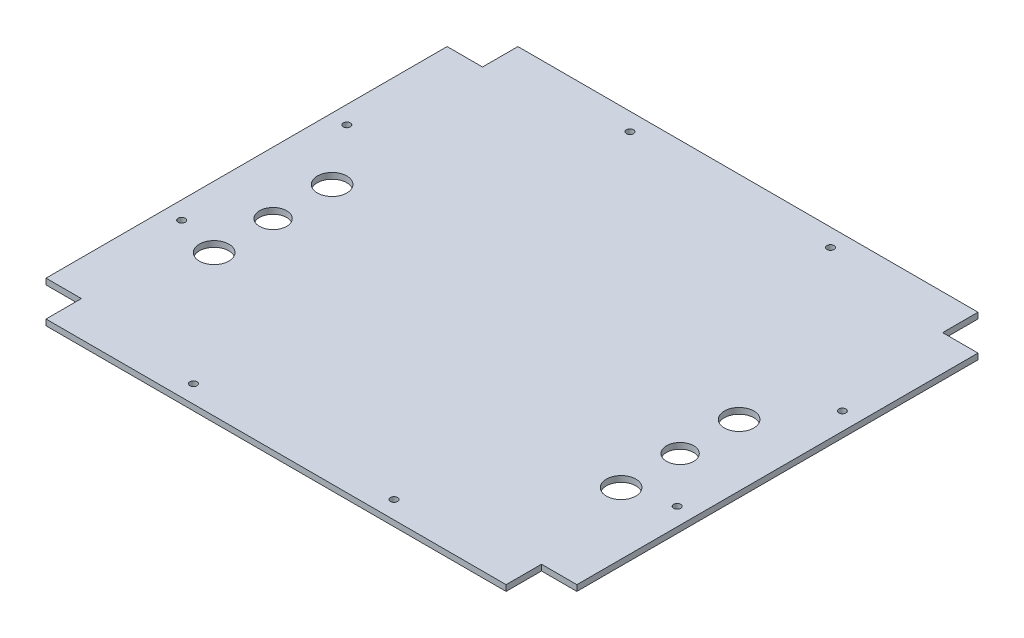
ISO-10303-21;
HEADER;
FILE_DESCRIPTION(('STEP AP214'),'2;1');
FILE_NAME('part.step','',(''),(''),'','','');
FILE_SCHEMA(('AUTOMOTIVE_DESIGN { 1 0 10303 214 1 1 1 1 }'));
ENDSEC;
DATA;
#1=APPLICATION_CONTEXT('core data for automotive mechanical design processes');
#2=APPLICATION_PROTOCOL_DEFINITION('international standard','automotive_design',2000,#1);
#3=PRODUCT_CONTEXT('',#1,'mechanical');
#4=PRODUCT('Part','Part','',(#3));
#5=PRODUCT_RELATED_PRODUCT_CATEGORY('part','',(#4));
#6=PRODUCT_DEFINITION_FORMATION('','',#4);
#7=PRODUCT_DEFINITION_CONTEXT('part definition',#1,'design');
#8=PRODUCT_DEFINITION('design','',#6,#7);
#9=PRODUCT_DEFINITION_SHAPE('','',#8);
#10=(LENGTH_UNIT() NAMED_UNIT(*) SI_UNIT(.MILLI.,.METRE.));
#11=(NAMED_UNIT(*) PLANE_ANGLE_UNIT() SI_UNIT($,.RADIAN.));
#12=(NAMED_UNIT(*) SI_UNIT($,.STERADIAN.) SOLID_ANGLE_UNIT());
#13=UNCERTAINTY_MEASURE_WITH_UNIT(LENGTH_MEASURE(1.E-05),#10,'distance_accuracy_value','');
#14=(GEOMETRIC_REPRESENTATION_CONTEXT(3) GLOBAL_UNCERTAINTY_ASSIGNED_CONTEXT((#13)) GLOBAL_UNIT_ASSIGNED_CONTEXT((#10,
#11,#12)) REPRESENTATION_CONTEXT('',''));
#15=CARTESIAN_POINT('',(0.,0.,0.));
#16=DIRECTION('',(0.,0.,1.));
#17=DIRECTION('',(1.,0.,0.));
#18=AXIS2_PLACEMENT_3D('',#15,#16,#17);
#19=CARTESIAN_POINT('',(0.,5.,0.));
#20=DIRECTION('',(0.,1.,0.));
#21=DIRECTION('',(0.,0.,1.));
#22=AXIS2_PLACEMENT_3D('',#19,#20,#21);
#23=PLANE('',#22);
#24=CARTESIAN_POINT('',(209.173151750973,5.,64.0178783294164));
#25=DIRECTION('',(0.,1.,0.));
#26=DIRECTION('',(0.,0.,-1.));
#27=AXIS2_PLACEMENT_3D('',#24,#25,#26);
#28=CIRCLE('',#27,11.5);
#29=CARTESIAN_POINT('',(209.173151750973,5.,52.5178783294164));
#30=VERTEX_POINT('',#29);
#31=EDGE_CURVE('E331',#30,#30,#28,.T.);
#32=ORIENTED_EDGE('',*,*,#31,.F.);
#33=EDGE_LOOP('',(#32));
#34=FACE_BOUND('',#33,.T.);
#35=CARTESIAN_POINT('',(-135.826848249027,5.,14.0178783294164));
#36=DIRECTION('',(0.,1.,0.));
#37=DIRECTION('',(0.,0.,1.));
#38=AXIS2_PLACEMENT_3D('',#35,#36,#37);
#39=CIRCLE('',#38,12.5);
#40=CARTESIAN_POINT('',(-135.826848249027,5.,26.5178783294164));
#41=VERTEX_POINT('',#40);
#42=EDGE_CURVE('E343',#41,#41,#39,.T.);
#43=ORIENTED_EDGE('',*,*,#42,.F.);
#44=EDGE_LOOP('',(#43));
#45=FACE_BOUND('',#44,.T.);
#46=CARTESIAN_POINT('',(-135.826848249027,5.,64.0178783294164));
#47=DIRECTION('',(0.,1.,0.));
#48=DIRECTION('',(0.,0.,1.));
#49=AXIS2_PLACEMENT_3D('',#46,#47,#48);
#50=CIRCLE('',#49,11.5);
#51=CARTESIAN_POINT('',(-135.826848249027,5.,75.5178783294164));
#52=VERTEX_POINT('',#51);
#53=EDGE_CURVE('E355',#52,#52,#50,.T.);
#54=ORIENTED_EDGE('',*,*,#53,.F.);
#55=EDGE_LOOP('',(#54));
#56=FACE_BOUND('',#55,.T.);
#57=CARTESIAN_POINT('',(-48.3268482490272,5.,219.017878329416));
#58=DIRECTION('',(0.,1.,0.));
#59=DIRECTION('',(0.,0.,1.));
#60=AXIS2_PLACEMENT_3D('',#57,#58,#59);
#61=CIRCLE('',#60,3.00000000000003);
#62=CARTESIAN_POINT('',(-48.3268482490272,5.,222.017878329416));
#63=VERTEX_POINT('',#62);
#64=EDGE_CURVE('E367',#63,#63,#61,.T.);
#65=ORIENTED_EDGE('',*,*,#64,.F.);
#66=EDGE_LOOP('',(#65));
#67=FACE_BOUND('',#66,.T.);
#68=CARTESIAN_POINT('',(246.673151750973,5.,-35.9821216705841));
#69=DIRECTION('',(0.,1.,0.));
#70=DIRECTION('',(0.,0.,1.));
#71=AXIS2_PLACEMENT_3D('',#68,#69,#70);
#72=CIRCLE('',#71,2.99999999999999);
#73=CARTESIAN_POINT('',(246.673151750973,5.,-32.9821216705842));
#74=VERTEX_POINT('',#73);
#75=EDGE_CURVE('E379',#74,#74,#72,.T.);
#76=ORIENTED_EDGE('',*,*,#75,.F.);
#77=EDGE_LOOP('',(#76));
#78=FACE_BOUND('',#77,.T.);
#79=CARTESIAN_POINT('',(-48.3268482490273,5.,-150.982121670584));
#80=DIRECTION('',(0.,1.,0.));
#81=DIRECTION('',(0.,0.,1.));
#82=AXIS2_PLACEMENT_3D('',#79,#80,#81);
#83=CIRCLE('',#82,2.99999999999999);
#84=CARTESIAN_POINT('',(-48.3268482490273,5.,-147.982121670584));
#85=VERTEX_POINT('',#84);
#86=EDGE_CURVE('E391',#85,#85,#83,.T.);
#87=ORIENTED_EDGE('',*,*,#86,.F.);
#88=EDGE_LOOP('',(#87));
#89=FACE_BOUND('',#88,.T.);
#90=CARTESIAN_POINT('',(-173.326848249027,5.,-35.9821216705836));
#91=DIRECTION('',(0.,1.,0.));
#92=DIRECTION('',(0.,0.,1.));
#93=AXIS2_PLACEMENT_3D('',#90,#91,#92);
#94=CIRCLE('',#93,2.99999999999999);
#95=CARTESIAN_POINT('',(-173.326848249027,5.,-32.9821216705836));
#96=VERTEX_POINT('',#95);
#97=EDGE_CURVE('E157',#96,#96,#94,.T.);
#98=ORIENTED_EDGE('',*,*,#97,.F.);
#99=EDGE_LOOP('',(#98));
#100=FACE_BOUND('',#99,.T.);
#101=DIRECTION('',(0.,0.,1.));
#102=VECTOR('',#101,1.);
#103=CARTESIAN_POINT('',(-158.326848249027,5.,-165.982121670584));
#104=LINE('',#103,#102);
#105=CARTESIAN_POINT('',(-158.326848249027,5.,-165.982121670584));
#106=VERTEX_POINT('',#105);
#107=CARTESIAN_POINT('',(-158.326848249027,5.,-135.982121670584));
#108=VERTEX_POINT('',#107);
#109=EDGE_CURVE('E176',#106,#108,#104,.T.);
#110=ORIENTED_EDGE('',*,*,#109,.T.);
#111=DIRECTION('',(-1.,0.,0.));
#112=VECTOR('',#111,1.);
#113=CARTESIAN_POINT('',(-188.326848249027,5.,-135.982121670584));
#114=LINE('',#113,#112);
#115=CARTESIAN_POINT('',(-188.326848249027,5.,-135.982121670584));
#116=VERTEX_POINT('',#115);
#117=EDGE_CURVE('E104',#108,#116,#114,.T.);
#118=ORIENTED_EDGE('',*,*,#117,.T.);
#119=DIRECTION('',(0.,0.,1.));
#120=VECTOR('',#119,1.);
#121=CARTESIAN_POINT('',(-188.326848249027,5.,-135.982121670584));
#122=LINE('',#121,#120);
#123=CARTESIAN_POINT('',(-188.326848249027,5.,204.017878329416));
#124=VERTEX_POINT('',#123);
#125=EDGE_CURVE('E203',#116,#124,#122,.T.);
#126=ORIENTED_EDGE('',*,*,#125,.T.);
#127=DIRECTION('',(1.,0.,0.));
#128=VECTOR('',#127,1.);
#129=CARTESIAN_POINT('',(-188.326848249027,5.,204.017878329416));
#130=LINE('',#129,#128);
#131=CARTESIAN_POINT('',(-158.326848249027,5.,204.017878329416));
#132=VERTEX_POINT('',#131);
#133=EDGE_CURVE('E222',#124,#132,#130,.T.);
#134=ORIENTED_EDGE('',*,*,#133,.T.);
#135=DIRECTION('',(0.,0.,1.));
#136=VECTOR('',#135,1.);
#137=CARTESIAN_POINT('',(-158.326848249027,5.,234.017878329416));
#138=LINE('',#137,#136);
#139=CARTESIAN_POINT('',(-158.326848249027,5.,234.017878329416));
#140=VERTEX_POINT('',#139);
#141=EDGE_CURVE('E219',#132,#140,#138,.T.);
#142=ORIENTED_EDGE('',*,*,#141,.T.);
#143=DIRECTION('',(1.,0.,0.));
#144=VECTOR('',#143,1.);
#145=CARTESIAN_POINT('',(-158.326848249027,5.,234.017878329416));
#146=LINE('',#145,#144);
#147=CARTESIAN_POINT('',(231.673151750973,5.,234.017878329416));
#148=VERTEX_POINT('',#147);
#149=EDGE_CURVE('E221',#140,#148,#146,.T.);
#150=ORIENTED_EDGE('',*,*,#149,.T.);
#151=DIRECTION('',(0.,0.,-1.));
#152=VECTOR('',#151,1.);
#153=CARTESIAN_POINT('',(231.673151750973,5.,234.017878329416));
#154=LINE('',#153,#152);
#155=CARTESIAN_POINT('',(231.673151750973,5.,204.017878329416));
#156=VERTEX_POINT('',#155);
#157=EDGE_CURVE('E224',#148,#156,#154,.T.);
#158=ORIENTED_EDGE('',*,*,#157,.T.);
#159=DIRECTION('',(1.,0.,0.));
#160=VECTOR('',#159,1.);
#161=CARTESIAN_POINT('',(261.673151750973,5.,204.017878329416));
#162=LINE('',#161,#160);
#163=CARTESIAN_POINT('',(261.673151750973,5.,204.017878329416));
#164=VERTEX_POINT('',#163);
#165=EDGE_CURVE('E230',#156,#164,#162,.T.);
#166=ORIENTED_EDGE('',*,*,#165,.T.);
#167=DIRECTION('',(0.,0.,-1.));
#168=VECTOR('',#167,1.);
#169=CARTESIAN_POINT('',(261.673151750973,5.,-135.982121670584));
#170=LINE('',#169,#168);
#171=CARTESIAN_POINT('',(261.673151750973,5.,-135.982121670584));
#172=VERTEX_POINT('',#171);
#173=EDGE_CURVE('E135',#164,#172,#170,.T.);
#174=ORIENTED_EDGE('',*,*,#173,.T.);
#175=DIRECTION('',(-1.,0.,0.));
#176=VECTOR('',#175,1.);
#177=CARTESIAN_POINT('',(261.673151750973,5.,-135.982121670584));
#178=LINE('',#177,#176);
#179=CARTESIAN_POINT('',(231.673151750973,5.,-135.982121670584));
#180=VERTEX_POINT('',#179);
#181=EDGE_CURVE('E129',#172,#180,#178,.T.);
#182=ORIENTED_EDGE('',*,*,#181,.T.);
#183=DIRECTION('',(0.,0.,-1.));
#184=VECTOR('',#183,1.);
#185=CARTESIAN_POINT('',(231.673151750973,5.,-165.982121670584));
#186=LINE('',#185,#184);
#187=CARTESIAN_POINT('',(231.673151750973,5.,-165.982121670584));
#188=VERTEX_POINT('',#187);
#189=EDGE_CURVE('E133',#180,#188,#186,.T.);
#190=ORIENTED_EDGE('',*,*,#189,.T.);
#191=DIRECTION('',(-1.,0.,0.));
#192=VECTOR('',#191,1.);
#193=CARTESIAN_POINT('',(-158.326848249027,5.,-165.982121670584));
#194=LINE('',#193,#192);
#195=EDGE_CURVE('E49',#188,#106,#194,.T.);
#196=ORIENTED_EDGE('',*,*,#195,.T.);
#197=EDGE_LOOP('',(#110,#118,#126,#134,#142,#150,#158,#166,#174,#182,#190,#196));
#198=FACE_BOUND('',#197,.T.);
#199=CARTESIAN_POINT('',(-173.326848249027,5.,104.017878329416));
#200=DIRECTION('',(0.,1.,0.));
#201=DIRECTION('',(0.,0.,1.));
#202=AXIS2_PLACEMENT_3D('',#199,#200,#201);
#203=CIRCLE('',#202,2.99999999999999);
#204=CARTESIAN_POINT('',(-173.326848249027,5.,107.017878329416));
#205=VERTEX_POINT('',#204);
#206=EDGE_CURVE('E397',#205,#205,#203,.T.);
#207=ORIENTED_EDGE('',*,*,#206,.F.);
#208=EDGE_LOOP('',(#207));
#209=FACE_BOUND('',#208,.T.);
#210=CARTESIAN_POINT('',(121.673151750973,5.,-150.982121670584));
#211=DIRECTION('',(0.,1.,0.));
#212=DIRECTION('',(0.,0.,1.));
#213=AXIS2_PLACEMENT_3D('',#210,#211,#212);
#214=CIRCLE('',#213,2.99999999999999);
#215=CARTESIAN_POINT('',(121.673151750973,5.,-147.982121670584));
#216=VERTEX_POINT('',#215);
#217=EDGE_CURVE('E385',#216,#216,#214,.T.);
#218=ORIENTED_EDGE('',*,*,#217,.F.);
#219=EDGE_LOOP('',(#218));
#220=FACE_BOUND('',#219,.T.);
#221=CARTESIAN_POINT('',(246.673151750973,5.,104.017878329416));
#222=DIRECTION('',(0.,1.,0.));
#223=DIRECTION('',(0.,0.,1.));
#224=AXIS2_PLACEMENT_3D('',#221,#222,#223);
#225=CIRCLE('',#224,2.99999999999999);
#226=CARTESIAN_POINT('',(246.673151750973,5.,107.017878329416));
#227=VERTEX_POINT('',#226);
#228=EDGE_CURVE('E373',#227,#227,#225,.T.);
#229=ORIENTED_EDGE('',*,*,#228,.F.);
#230=EDGE_LOOP('',(#229));
#231=FACE_BOUND('',#230,.T.);
#232=CARTESIAN_POINT('',(121.673151750973,5.,219.017878329416));
#233=DIRECTION('',(0.,1.,0.));
#234=DIRECTION('',(0.,0.,1.));
#235=AXIS2_PLACEMENT_3D('',#232,#233,#234);
#236=CIRCLE('',#235,3.00000000000011);
#237=CARTESIAN_POINT('',(121.673151750973,5.,222.017878329417));
#238=VERTEX_POINT('',#237);
#239=EDGE_CURVE('E361',#238,#238,#236,.T.);
#240=ORIENTED_EDGE('',*,*,#239,.F.);
#241=EDGE_LOOP('',(#240));
#242=FACE_BOUND('',#241,.T.);
#243=CARTESIAN_POINT('',(-135.826848249027,5.,114.017878329416));
#244=DIRECTION('',(0.,1.,0.));
#245=DIRECTION('',(0.,0.,1.));
#246=AXIS2_PLACEMENT_3D('',#243,#244,#245);
#247=CIRCLE('',#246,12.5);
#248=CARTESIAN_POINT('',(-135.826848249027,5.,126.517878329416));
#249=VERTEX_POINT('',#248);
#250=EDGE_CURVE('E349',#249,#249,#247,.T.);
#251=ORIENTED_EDGE('',*,*,#250,.F.);
#252=EDGE_LOOP('',(#251));
#253=FACE_BOUND('',#252,.T.);
#254=CARTESIAN_POINT('',(209.173151750973,5.,114.017878329416));
#255=DIRECTION('',(0.,1.,0.));
#256=DIRECTION('',(0.,0.,-1.));
#257=AXIS2_PLACEMENT_3D('',#254,#255,#256);
#258=CIRCLE('',#257,12.5);
#259=CARTESIAN_POINT('',(209.173151750973,5.,101.517878329416));
#260=VERTEX_POINT('',#259);
#261=EDGE_CURVE('E337',#260,#260,#258,.T.);
#262=ORIENTED_EDGE('',*,*,#261,.F.);
#263=EDGE_LOOP('',(#262));
#264=FACE_BOUND('',#263,.T.);
#265=CARTESIAN_POINT('',(209.173151750973,5.,14.0178783294164));
#266=DIRECTION('',(0.,1.,0.));
#267=DIRECTION('',(0.,0.,-1.));
#268=AXIS2_PLACEMENT_3D('',#265,#266,#267);
#269=CIRCLE('',#268,12.5);
#270=CARTESIAN_POINT('',(209.173151750973,5.,1.5178783294164));
#271=VERTEX_POINT('',#270);
#272=EDGE_CURVE('E322',#271,#271,#269,.T.);
#273=ORIENTED_EDGE('',*,*,#272,.F.);
#274=EDGE_LOOP('',(#273));
#275=FACE_BOUND('',#274,.T.);
#276=ADVANCED_FACE('F32',(#34,#45,#56,#67,#78,#89,#100,#198,#209,#220,#231,#242,#253,#264,#275),
#23,.T.);
#277=CARTESIAN_POINT('',(0.,0.,0.));
#278=DIRECTION('',(0.,1.,0.));
#279=DIRECTION('',(0.,0.,1.));
#280=AXIS2_PLACEMENT_3D('',#277,#278,#279);
#281=PLANE('',#280);
#282=CARTESIAN_POINT('',(209.173151750973,0.,64.0178783294164));
#283=DIRECTION('',(0.,1.,0.));
#284=DIRECTION('',(0.,0.,-1.));
#285=AXIS2_PLACEMENT_3D('',#282,#283,#284);
#286=CIRCLE('',#285,11.5);
#287=CARTESIAN_POINT('',(209.173151750973,0.,52.5178783294164));
#288=VERTEX_POINT('',#287);
#289=EDGE_CURVE('E328',#288,#288,#286,.T.);
#290=ORIENTED_EDGE('',*,*,#289,.T.);
#291=EDGE_LOOP('',(#290));
#292=FACE_BOUND('',#291,.T.);
#293=CARTESIAN_POINT('',(-135.826848249027,0.,14.0178783294164));
#294=DIRECTION('',(0.,1.,0.));
#295=DIRECTION('',(0.,0.,1.));
#296=AXIS2_PLACEMENT_3D('',#293,#294,#295);
#297=CIRCLE('',#296,12.5);
#298=CARTESIAN_POINT('',(-135.826848249027,0.,26.5178783294164));
#299=VERTEX_POINT('',#298);
#300=EDGE_CURVE('E340',#299,#299,#297,.T.);
#301=ORIENTED_EDGE('',*,*,#300,.T.);
#302=EDGE_LOOP('',(#301));
#303=FACE_BOUND('',#302,.T.);
#304=CARTESIAN_POINT('',(-135.826848249027,0.,64.0178783294164));
#305=DIRECTION('',(0.,1.,0.));
#306=DIRECTION('',(0.,0.,1.));
#307=AXIS2_PLACEMENT_3D('',#304,#305,#306);
#308=CIRCLE('',#307,11.5);
#309=CARTESIAN_POINT('',(-135.826848249027,0.,75.5178783294164));
#310=VERTEX_POINT('',#309);
#311=EDGE_CURVE('E352',#310,#310,#308,.T.);
#312=ORIENTED_EDGE('',*,*,#311,.T.);
#313=EDGE_LOOP('',(#312));
#314=FACE_BOUND('',#313,.T.);
#315=CARTESIAN_POINT('',(-48.3268482490272,0.,219.017878329416));
#316=DIRECTION('',(0.,1.,0.));
#317=DIRECTION('',(0.,0.,1.));
#318=AXIS2_PLACEMENT_3D('',#315,#316,#317);
#319=CIRCLE('',#318,3.00000000000003);
#320=CARTESIAN_POINT('',(-48.3268482490272,0.,222.017878329416));
#321=VERTEX_POINT('',#320);
#322=EDGE_CURVE('E364',#321,#321,#319,.T.);
#323=ORIENTED_EDGE('',*,*,#322,.T.);
#324=EDGE_LOOP('',(#323));
#325=FACE_BOUND('',#324,.T.);
#326=CARTESIAN_POINT('',(246.673151750973,0.,-35.9821216705841));
#327=DIRECTION('',(0.,1.,0.));
#328=DIRECTION('',(0.,0.,1.));
#329=AXIS2_PLACEMENT_3D('',#326,#327,#328);
#330=CIRCLE('',#329,2.99999999999999);
#331=CARTESIAN_POINT('',(246.673151750973,0.,-32.9821216705842));
#332=VERTEX_POINT('',#331);
#333=EDGE_CURVE('E376',#332,#332,#330,.T.);
#334=ORIENTED_EDGE('',*,*,#333,.T.);
#335=EDGE_LOOP('',(#334));
#336=FACE_BOUND('',#335,.T.);
#337=CARTESIAN_POINT('',(-48.3268482490273,0.,-150.982121670584));
#338=DIRECTION('',(0.,1.,0.));
#339=DIRECTION('',(0.,0.,1.));
#340=AXIS2_PLACEMENT_3D('',#337,#338,#339);
#341=CIRCLE('',#340,2.99999999999999);
#342=CARTESIAN_POINT('',(-48.3268482490273,0.,-147.982121670584));
#343=VERTEX_POINT('',#342);
#344=EDGE_CURVE('E388',#343,#343,#341,.T.);
#345=ORIENTED_EDGE('',*,*,#344,.T.);
#346=EDGE_LOOP('',(#345));
#347=FACE_BOUND('',#346,.T.);
#348=CARTESIAN_POINT('',(-173.326848249027,0.,-35.9821216705836));
#349=DIRECTION('',(0.,1.,0.));
#350=DIRECTION('',(0.,0.,1.));
#351=AXIS2_PLACEMENT_3D('',#348,#349,#350);
#352=CIRCLE('',#351,2.99999999999999);
#353=CARTESIAN_POINT('',(-173.326848249027,0.,-32.9821216705836));
#354=VERTEX_POINT('',#353);
#355=EDGE_CURVE('E400',#354,#354,#352,.T.);
#356=ORIENTED_EDGE('',*,*,#355,.T.);
#357=EDGE_LOOP('',(#356));
#358=FACE_BOUND('',#357,.T.);
#359=DIRECTION('',(0.,0.,1.));
#360=VECTOR('',#359,1.);
#361=CARTESIAN_POINT('',(-158.326848249027,0.,-165.982121670584));
#362=LINE('',#361,#360);
#363=CARTESIAN_POINT('',(-158.326848249027,0.,-165.982121670584));
#364=VERTEX_POINT('',#363);
#365=CARTESIAN_POINT('',(-158.326848249027,0.,-135.982121670584));
#366=VERTEX_POINT('',#365);
#367=EDGE_CURVE('E153',#364,#366,#362,.T.);
#368=ORIENTED_EDGE('',*,*,#367,.F.);
#369=DIRECTION('',(-1.,0.,0.));
#370=VECTOR('',#369,1.);
#371=CARTESIAN_POINT('',(-158.326848249027,0.,-165.982121670584));
#372=LINE('',#371,#370);
#373=CARTESIAN_POINT('',(231.673151750973,0.,-165.982121670584));
#374=VERTEX_POINT('',#373);
#375=EDGE_CURVE('E96',#374,#364,#372,.T.);
#376=ORIENTED_EDGE('',*,*,#375,.F.);
#377=DIRECTION('',(0.,0.,-1.));
#378=VECTOR('',#377,1.);
#379=CARTESIAN_POINT('',(231.673151750973,0.,-165.982121670584));
#380=LINE('',#379,#378);
#381=CARTESIAN_POINT('',(231.673151750973,0.,-135.982121670584));
#382=VERTEX_POINT('',#381);
#383=EDGE_CURVE('E90',#382,#374,#380,.T.);
#384=ORIENTED_EDGE('',*,*,#383,.F.);
#385=DIRECTION('',(-1.,0.,0.));
#386=VECTOR('',#385,1.);
#387=CARTESIAN_POINT('',(261.673151750973,0.,-135.982121670584));
#388=LINE('',#387,#386);
#389=CARTESIAN_POINT('',(261.673151750973,0.,-135.982121670584));
#390=VERTEX_POINT('',#389);
#391=EDGE_CURVE('E143',#390,#382,#388,.T.);
#392=ORIENTED_EDGE('',*,*,#391,.F.);
#393=DIRECTION('',(0.,0.,-1.));
#394=VECTOR('',#393,1.);
#395=CARTESIAN_POINT('',(261.673151750973,0.,-135.982121670584));
#396=LINE('',#395,#394);
#397=CARTESIAN_POINT('',(261.673151750973,0.,204.017878329416));
#398=VERTEX_POINT('',#397);
#399=EDGE_CURVE('E171',#398,#390,#396,.T.);
#400=ORIENTED_EDGE('',*,*,#399,.F.);
#401=DIRECTION('',(1.,0.,0.));
#402=VECTOR('',#401,1.);
#403=CARTESIAN_POINT('',(261.673151750973,0.,204.017878329416));
#404=LINE('',#403,#402);
#405=CARTESIAN_POINT('',(231.673151750973,0.,204.017878329416));
#406=VERTEX_POINT('',#405);
#407=EDGE_CURVE('E169',#406,#398,#404,.T.);
#408=ORIENTED_EDGE('',*,*,#407,.F.);
#409=DIRECTION('',(0.,0.,-1.));
#410=VECTOR('',#409,1.);
#411=CARTESIAN_POINT('',(231.673151750973,0.,234.017878329416));
#412=LINE('',#411,#410);
#413=CARTESIAN_POINT('',(231.673151750973,0.,234.017878329416));
#414=VERTEX_POINT('',#413);
#415=EDGE_CURVE('E167',#414,#406,#412,.T.);
#416=ORIENTED_EDGE('',*,*,#415,.F.);
#417=DIRECTION('',(1.,0.,0.));
#418=VECTOR('',#417,1.);
#419=CARTESIAN_POINT('',(-158.326848249027,0.,234.017878329416));
#420=LINE('',#419,#418);
#421=CARTESIAN_POINT('',(-158.326848249027,0.,234.017878329416));
#422=VERTEX_POINT('',#421);
#423=EDGE_CURVE('E165',#422,#414,#420,.T.);
#424=ORIENTED_EDGE('',*,*,#423,.F.);
#425=DIRECTION('',(0.,0.,1.));
#426=VECTOR('',#425,1.);
#427=CARTESIAN_POINT('',(-158.326848249027,0.,234.017878329416));
#428=LINE('',#427,#426);
#429=CARTESIAN_POINT('',(-158.326848249027,0.,204.017878329416));
#430=VERTEX_POINT('',#429);
#431=EDGE_CURVE('E163',#430,#422,#428,.T.);
#432=ORIENTED_EDGE('',*,*,#431,.F.);
#433=DIRECTION('',(1.,0.,0.));
#434=VECTOR('',#433,1.);
#435=CARTESIAN_POINT('',(-188.326848249027,0.,204.017878329416));
#436=LINE('',#435,#434);
#437=CARTESIAN_POINT('',(-188.326848249027,0.,204.017878329416));
#438=VERTEX_POINT('',#437);
#439=EDGE_CURVE('E161',#438,#430,#436,.T.);
#440=ORIENTED_EDGE('',*,*,#439,.F.);
#441=DIRECTION('',(0.,0.,1.));
#442=VECTOR('',#441,1.);
#443=CARTESIAN_POINT('',(-188.326848249027,0.,-135.982121670584));
#444=LINE('',#443,#442);
#445=CARTESIAN_POINT('',(-188.326848249027,0.,-135.982121670584));
#446=VERTEX_POINT('',#445);
#447=EDGE_CURVE('E159',#446,#438,#444,.T.);
#448=ORIENTED_EDGE('',*,*,#447,.F.);
#449=DIRECTION('',(-1.,0.,0.));
#450=VECTOR('',#449,1.);
#451=CARTESIAN_POINT('',(-188.326848249027,0.,-135.982121670584));
#452=LINE('',#451,#450);
#453=EDGE_CURVE('E156',#366,#446,#452,.T.);
#454=ORIENTED_EDGE('',*,*,#453,.F.);
#455=EDGE_LOOP('',(#368,#376,#384,#392,#400,#408,#416,#424,#432,#440,#448,#454));
#456=FACE_BOUND('',#455,.T.);
#457=CARTESIAN_POINT('',(-173.326848249027,0.,104.017878329416));
#458=DIRECTION('',(0.,1.,0.));
#459=DIRECTION('',(0.,0.,1.));
#460=AXIS2_PLACEMENT_3D('',#457,#458,#459);
#461=CIRCLE('',#460,2.99999999999999);
#462=CARTESIAN_POINT('',(-173.326848249027,0.,107.017878329416));
#463=VERTEX_POINT('',#462);
#464=EDGE_CURVE('E394',#463,#463,#461,.T.);
#465=ORIENTED_EDGE('',*,*,#464,.T.);
#466=EDGE_LOOP('',(#465));
#467=FACE_BOUND('',#466,.T.);
#468=CARTESIAN_POINT('',(121.673151750973,0.,-150.982121670584));
#469=DIRECTION('',(0.,1.,0.));
#470=DIRECTION('',(0.,0.,1.));
#471=AXIS2_PLACEMENT_3D('',#468,#469,#470);
#472=CIRCLE('',#471,2.99999999999999);
#473=CARTESIAN_POINT('',(121.673151750973,0.,-147.982121670584));
#474=VERTEX_POINT('',#473);
#475=EDGE_CURVE('E382',#474,#474,#472,.T.);
#476=ORIENTED_EDGE('',*,*,#475,.T.);
#477=EDGE_LOOP('',(#476));
#478=FACE_BOUND('',#477,.T.);
#479=CARTESIAN_POINT('',(246.673151750973,0.,104.017878329416));
#480=DIRECTION('',(0.,1.,0.));
#481=DIRECTION('',(0.,0.,1.));
#482=AXIS2_PLACEMENT_3D('',#479,#480,#481);
#483=CIRCLE('',#482,2.99999999999999);
#484=CARTESIAN_POINT('',(246.673151750973,0.,107.017878329416));
#485=VERTEX_POINT('',#484);
#486=EDGE_CURVE('E370',#485,#485,#483,.T.);
#487=ORIENTED_EDGE('',*,*,#486,.T.);
#488=EDGE_LOOP('',(#487));
#489=FACE_BOUND('',#488,.T.);
#490=CARTESIAN_POINT('',(121.673151750973,0.,219.017878329416));
#491=DIRECTION('',(0.,1.,0.));
#492=DIRECTION('',(0.,0.,1.));
#493=AXIS2_PLACEMENT_3D('',#490,#491,#492);
#494=CIRCLE('',#493,3.00000000000011);
#495=CARTESIAN_POINT('',(121.673151750973,0.,222.017878329417));
#496=VERTEX_POINT('',#495);
#497=EDGE_CURVE('E358',#496,#496,#494,.T.);
#498=ORIENTED_EDGE('',*,*,#497,.T.);
#499=EDGE_LOOP('',(#498));
#500=FACE_BOUND('',#499,.T.);
#501=CARTESIAN_POINT('',(-135.826848249027,0.,114.017878329416));
#502=DIRECTION('',(0.,1.,0.));
#503=DIRECTION('',(0.,0.,1.));
#504=AXIS2_PLACEMENT_3D('',#501,#502,#503);
#505=CIRCLE('',#504,12.5);
#506=CARTESIAN_POINT('',(-135.826848249027,0.,126.517878329416));
#507=VERTEX_POINT('',#506);
#508=EDGE_CURVE('E346',#507,#507,#505,.T.);
#509=ORIENTED_EDGE('',*,*,#508,.T.);
#510=EDGE_LOOP('',(#509));
#511=FACE_BOUND('',#510,.T.);
#512=CARTESIAN_POINT('',(209.173151750973,0.,114.017878329416));
#513=DIRECTION('',(0.,1.,0.));
#514=DIRECTION('',(0.,0.,-1.));
#515=AXIS2_PLACEMENT_3D('',#512,#513,#514);
#516=CIRCLE('',#515,12.5);
#517=CARTESIAN_POINT('',(209.173151750973,0.,101.517878329416));
#518=VERTEX_POINT('',#517);
#519=EDGE_CURVE('E334',#518,#518,#516,.T.);
#520=ORIENTED_EDGE('',*,*,#519,.T.);
#521=EDGE_LOOP('',(#520));
#522=FACE_BOUND('',#521,.T.);
#523=CARTESIAN_POINT('',(209.173151750973,0.,14.0178783294164));
#524=DIRECTION('',(0.,1.,0.));
#525=DIRECTION('',(0.,0.,-1.));
#526=AXIS2_PLACEMENT_3D('',#523,#524,#525);
#527=CIRCLE('',#526,12.5);
#528=CARTESIAN_POINT('',(209.173151750973,0.,1.5178783294164));
#529=VERTEX_POINT('',#528);
#530=EDGE_CURVE('E325',#529,#529,#527,.T.);
#531=ORIENTED_EDGE('',*,*,#530,.T.);
#532=EDGE_LOOP('',(#531));
#533=FACE_BOUND('',#532,.T.);
#534=ADVANCED_FACE('F207',(#292,#303,#314,#325,#336,#347,#358,#456,#467,#478,#489,#500,#511,
#522,#533),#281,.F.);
#535=CARTESIAN_POINT('',(-158.326848249027,5.,-165.982121670584));
#536=DIRECTION('',(1.,0.,0.));
#537=DIRECTION('',(0.,0.,-1.));
#538=AXIS2_PLACEMENT_3D('',#535,#536,#537);
#539=PLANE('',#538);
#540=ORIENTED_EDGE('',*,*,#367,.T.);
#541=DIRECTION('',(0.,-1.,0.));
#542=VECTOR('',#541,1.);
#543=CARTESIAN_POINT('',(-158.326848249027,5.,-135.982121670584));
#544=LINE('',#543,#542);
#545=EDGE_CURVE('E11',#108,#366,#544,.T.);
#546=ORIENTED_EDGE('',*,*,#545,.F.);
#547=ORIENTED_EDGE('',*,*,#109,.F.);
#548=DIRECTION('',(0.,-1.,0.));
#549=VECTOR('',#548,1.);
#550=CARTESIAN_POINT('',(-158.326848249027,5.,-165.982121670584));
#551=LINE('',#550,#549);
#552=EDGE_CURVE('E149',#106,#364,#551,.T.);
#553=ORIENTED_EDGE('',*,*,#552,.T.);
#554=EDGE_LOOP('',(#540,#546,#547,#553));
#555=FACE_BOUND('',#554,.T.);
#556=ADVANCED_FACE('F34',(#555),#539,.F.);
#557=CARTESIAN_POINT('',(-188.326848249027,5.,-135.982121670584));
#558=DIRECTION('',(0.,0.,1.));
#559=DIRECTION('',(1.,0.,0.));
#560=AXIS2_PLACEMENT_3D('',#557,#558,#559);
#561=PLANE('',#560);
#562=ORIENTED_EDGE('',*,*,#453,.T.);
#563=DIRECTION('',(0.,-1.,0.));
#564=VECTOR('',#563,1.);
#565=CARTESIAN_POINT('',(-188.326848249027,5.,-135.982121670584));
#566=LINE('',#565,#564);
#567=EDGE_CURVE('E41',#116,#446,#566,.T.);
#568=ORIENTED_EDGE('',*,*,#567,.F.);
#569=ORIENTED_EDGE('',*,*,#117,.F.);
#570=ORIENTED_EDGE('',*,*,#545,.T.);
#571=EDGE_LOOP('',(#562,#568,#569,#570));
#572=FACE_BOUND('',#571,.T.);
#573=ADVANCED_FACE('F599',(#572),#561,.F.);
#574=CARTESIAN_POINT('',(-188.326848249027,5.,-135.982121670584));
#575=DIRECTION('',(1.,0.,0.));
#576=DIRECTION('',(0.,0.,-1.));
#577=AXIS2_PLACEMENT_3D('',#574,#575,#576);
#578=PLANE('',#577);
#579=ORIENTED_EDGE('',*,*,#447,.T.);
#580=DIRECTION('',(0.,-1.,0.));
#581=VECTOR('',#580,1.);
#582=CARTESIAN_POINT('',(-188.326848249027,5.,204.017878329416));
#583=LINE('',#582,#581);
#584=EDGE_CURVE('E195',#124,#438,#583,.T.);
#585=ORIENTED_EDGE('',*,*,#584,.F.);
#586=ORIENTED_EDGE('',*,*,#125,.F.);
#587=ORIENTED_EDGE('',*,*,#567,.T.);
#588=EDGE_LOOP('',(#579,#585,#586,#587));
#589=FACE_BOUND('',#588,.T.);
#590=ADVANCED_FACE('F201',(#589),#578,.F.);
#591=CARTESIAN_POINT('',(-188.326848249027,5.,204.017878329416));
#592=DIRECTION('',(0.,0.,-1.));
#593=DIRECTION('',(-1.,0.,0.));
#594=AXIS2_PLACEMENT_3D('',#591,#592,#593);
#595=PLANE('',#594);
#596=ORIENTED_EDGE('',*,*,#439,.T.);
#597=DIRECTION('',(0.,-1.,0.));
#598=VECTOR('',#597,1.);
#599=CARTESIAN_POINT('',(-158.326848249027,5.,204.017878329416));
#600=LINE('',#599,#598);
#601=EDGE_CURVE('E192',#132,#430,#600,.T.);
#602=ORIENTED_EDGE('',*,*,#601,.F.);
#603=ORIENTED_EDGE('',*,*,#133,.F.);
#604=ORIENTED_EDGE('',*,*,#584,.T.);
#605=EDGE_LOOP('',(#596,#602,#603,#604));
#606=FACE_BOUND('',#605,.T.);
#607=ADVANCED_FACE('F213',(#606),#595,.F.);
#608=CARTESIAN_POINT('',(-158.326848249027,5.,234.017878329416));
#609=DIRECTION('',(1.,0.,0.));
#610=DIRECTION('',(0.,0.,-1.));
#611=AXIS2_PLACEMENT_3D('',#608,#609,#610);
#612=PLANE('',#611);
#613=ORIENTED_EDGE('',*,*,#431,.T.);
#614=DIRECTION('',(0.,-1.,0.));
#615=VECTOR('',#614,1.);
#616=CARTESIAN_POINT('',(-158.326848249027,5.,234.017878329416));
#617=LINE('',#616,#615);
#618=EDGE_CURVE('E189',#140,#422,#617,.T.);
#619=ORIENTED_EDGE('',*,*,#618,.F.);
#620=ORIENTED_EDGE('',*,*,#141,.F.);
#621=ORIENTED_EDGE('',*,*,#601,.T.);
#622=EDGE_LOOP('',(#613,#619,#620,#621));
#623=FACE_BOUND('',#622,.T.);
#624=ADVANCED_FACE('F217',(#623),#612,.F.);
#625=CARTESIAN_POINT('',(-158.326848249027,5.,234.017878329416));
#626=DIRECTION('',(0.,0.,-1.));
#627=DIRECTION('',(-1.,0.,0.));
#628=AXIS2_PLACEMENT_3D('',#625,#626,#627);
#629=PLANE('',#628);
#630=ORIENTED_EDGE('',*,*,#423,.T.);
#631=DIRECTION('',(0.,-1.,0.));
#632=VECTOR('',#631,1.);
#633=CARTESIAN_POINT('',(231.673151750973,5.,234.017878329416));
#634=LINE('',#633,#632);
#635=EDGE_CURVE('E186',#148,#414,#634,.T.);
#636=ORIENTED_EDGE('',*,*,#635,.F.);
#637=ORIENTED_EDGE('',*,*,#149,.F.);
#638=ORIENTED_EDGE('',*,*,#618,.T.);
#639=EDGE_LOOP('',(#630,#636,#637,#638));
#640=FACE_BOUND('',#639,.T.);
#641=ADVANCED_FACE('F564',(#640),#629,.F.);
#642=CARTESIAN_POINT('',(231.673151750973,5.,234.017878329416));
#643=DIRECTION('',(-1.,0.,0.));
#644=DIRECTION('',(0.,0.,1.));
#645=AXIS2_PLACEMENT_3D('',#642,#643,#644);
#646=PLANE('',#645);
#647=ORIENTED_EDGE('',*,*,#415,.T.);
#648=DIRECTION('',(0.,-1.,0.));
#649=VECTOR('',#648,1.);
#650=CARTESIAN_POINT('',(231.673151750973,5.,204.017878329416));
#651=LINE('',#650,#649);
#652=EDGE_CURVE('E183',#156,#406,#651,.T.);
#653=ORIENTED_EDGE('',*,*,#652,.F.);
#654=ORIENTED_EDGE('',*,*,#157,.F.);
#655=ORIENTED_EDGE('',*,*,#635,.T.);
#656=EDGE_LOOP('',(#647,#653,#654,#655));
#657=FACE_BOUND('',#656,.T.);
#658=ADVANCED_FACE('F555',(#657),#646,.F.);
#659=CARTESIAN_POINT('',(261.673151750973,5.,204.017878329416));
#660=DIRECTION('',(0.,0.,-1.));
#661=DIRECTION('',(-1.,0.,0.));
#662=AXIS2_PLACEMENT_3D('',#659,#660,#661);
#663=PLANE('',#662);
#664=ORIENTED_EDGE('',*,*,#407,.T.);
#665=DIRECTION('',(0.,-1.,0.));
#666=VECTOR('',#665,1.);
#667=CARTESIAN_POINT('',(261.673151750973,5.,204.017878329416));
#668=LINE('',#667,#666);
#669=EDGE_CURVE('E180',#164,#398,#668,.T.);
#670=ORIENTED_EDGE('',*,*,#669,.F.);
#671=ORIENTED_EDGE('',*,*,#165,.F.);
#672=ORIENTED_EDGE('',*,*,#652,.T.);
#673=EDGE_LOOP('',(#664,#670,#671,#672));
#674=FACE_BOUND('',#673,.T.);
#675=ADVANCED_FACE('F236',(#674),#663,.F.);
#676=CARTESIAN_POINT('',(261.673151750973,5.,-135.982121670584));
#677=DIRECTION('',(-1.,0.,0.));
#678=DIRECTION('',(0.,0.,1.));
#679=AXIS2_PLACEMENT_3D('',#676,#677,#678);
#680=PLANE('',#679);
#681=ORIENTED_EDGE('',*,*,#399,.T.);
#682=DIRECTION('',(0.,-1.,0.));
#683=VECTOR('',#682,1.);
#684=CARTESIAN_POINT('',(261.673151750973,5.,-135.982121670584));
#685=LINE('',#684,#683);
#686=EDGE_CURVE('E144',#172,#390,#685,.T.);
#687=ORIENTED_EDGE('',*,*,#686,.F.);
#688=ORIENTED_EDGE('',*,*,#173,.F.);
#689=ORIENTED_EDGE('',*,*,#669,.T.);
#690=EDGE_LOOP('',(#681,#687,#688,#689));
#691=FACE_BOUND('',#690,.T.);
#692=ADVANCED_FACE('F240',(#691),#680,.F.);
#693=CARTESIAN_POINT('',(261.673151750973,5.,-135.982121670584));
#694=DIRECTION('',(0.,0.,1.));
#695=DIRECTION('',(1.,0.,0.));
#696=AXIS2_PLACEMENT_3D('',#693,#694,#695);
#697=PLANE('',#696);
#698=ORIENTED_EDGE('',*,*,#391,.T.);
#699=DIRECTION('',(0.,-1.,0.));
#700=VECTOR('',#699,1.);
#701=CARTESIAN_POINT('',(231.673151750973,5.,-135.982121670584));
#702=LINE('',#701,#700);
#703=EDGE_CURVE('E140',#180,#382,#702,.T.);
#704=ORIENTED_EDGE('',*,*,#703,.F.);
#705=ORIENTED_EDGE('',*,*,#181,.F.);
#706=ORIENTED_EDGE('',*,*,#686,.T.);
#707=EDGE_LOOP('',(#698,#704,#705,#706));
#708=FACE_BOUND('',#707,.T.);
#709=ADVANCED_FACE('F141',(#708),#697,.F.);
#710=CARTESIAN_POINT('',(231.673151750973,5.,-165.982121670584));
#711=DIRECTION('',(-1.,0.,0.));
#712=DIRECTION('',(0.,0.,1.));
#713=AXIS2_PLACEMENT_3D('',#710,#711,#712);
#714=PLANE('',#713);
#715=ORIENTED_EDGE('',*,*,#383,.T.);
#716=DIRECTION('',(0.,-1.,0.));
#717=VECTOR('',#716,1.);
#718=CARTESIAN_POINT('',(231.673151750973,5.,-165.982121670584));
#719=LINE('',#718,#717);
#720=EDGE_CURVE('E145',#188,#374,#719,.T.);
#721=ORIENTED_EDGE('',*,*,#720,.F.);
#722=ORIENTED_EDGE('',*,*,#189,.F.);
#723=ORIENTED_EDGE('',*,*,#703,.T.);
#724=EDGE_LOOP('',(#715,#721,#722,#723));
#725=FACE_BOUND('',#724,.T.);
#726=ADVANCED_FACE('F147',(#725),#714,.F.);
#727=CARTESIAN_POINT('',(-158.326848249027,5.,-165.982121670584));
#728=DIRECTION('',(0.,0.,1.));
#729=DIRECTION('',(1.,0.,0.));
#730=AXIS2_PLACEMENT_3D('',#727,#728,#729);
#731=PLANE('',#730);
#732=ORIENTED_EDGE('',*,*,#375,.T.);
#733=ORIENTED_EDGE('',*,*,#552,.F.);
#734=ORIENTED_EDGE('',*,*,#195,.F.);
#735=ORIENTED_EDGE('',*,*,#720,.T.);
#736=EDGE_LOOP('',(#732,#733,#734,#735));
#737=FACE_BOUND('',#736,.T.);
#738=ADVANCED_FACE('F244',(#737),#731,.F.);
#739=CARTESIAN_POINT('',(-173.326848249027,5.,-35.9821216705836));
#740=DIRECTION('',(0.,-1.,0.));
#741=DIRECTION('',(0.,0.,-1.));
#742=AXIS2_PLACEMENT_3D('',#739,#740,#741);
#743=CYLINDRICAL_SURFACE('',#742,2.99999999999999);
#744=ORIENTED_EDGE('',*,*,#97,.T.);
#745=EDGE_LOOP('',(#744));
#746=FACE_BOUND('',#745,.T.);
#747=ORIENTED_EDGE('',*,*,#355,.F.);
#748=EDGE_LOOP('',(#747));
#749=FACE_BOUND('',#748,.T.);
#750=ADVANCED_FACE('F246',(#746,#749),#743,.F.);
#751=CARTESIAN_POINT('',(-173.326848249027,5.,104.017878329416));
#752=DIRECTION('',(0.,-1.,0.));
#753=DIRECTION('',(0.,0.,-1.));
#754=AXIS2_PLACEMENT_3D('',#751,#752,#753);
#755=CYLINDRICAL_SURFACE('',#754,2.99999999999999);
#756=ORIENTED_EDGE('',*,*,#206,.T.);
#757=EDGE_LOOP('',(#756));
#758=FACE_BOUND('',#757,.T.);
#759=ORIENTED_EDGE('',*,*,#464,.F.);
#760=EDGE_LOOP('',(#759));
#761=FACE_BOUND('',#760,.T.);
#762=ADVANCED_FACE('F252',(#758,#761),#755,.F.);
#763=CARTESIAN_POINT('',(-48.3268482490273,5.,-150.982121670584));
#764=DIRECTION('',(0.,-1.,0.));
#765=DIRECTION('',(0.,0.,-1.));
#766=AXIS2_PLACEMENT_3D('',#763,#764,#765);
#767=CYLINDRICAL_SURFACE('',#766,2.99999999999999);
#768=ORIENTED_EDGE('',*,*,#86,.T.);
#769=EDGE_LOOP('',(#768));
#770=FACE_BOUND('',#769,.T.);
#771=ORIENTED_EDGE('',*,*,#344,.F.);
#772=EDGE_LOOP('',(#771));
#773=FACE_BOUND('',#772,.T.);
#774=ADVANCED_FACE('F269',(#770,#773),#767,.F.);
#775=CARTESIAN_POINT('',(121.673151750973,5.,-150.982121670584));
#776=DIRECTION('',(0.,-1.,0.));
#777=DIRECTION('',(0.,0.,-1.));
#778=AXIS2_PLACEMENT_3D('',#775,#776,#777);
#779=CYLINDRICAL_SURFACE('',#778,2.99999999999999);
#780=ORIENTED_EDGE('',*,*,#217,.T.);
#781=EDGE_LOOP('',(#780));
#782=FACE_BOUND('',#781,.T.);
#783=ORIENTED_EDGE('',*,*,#475,.F.);
#784=EDGE_LOOP('',(#783));
#785=FACE_BOUND('',#784,.T.);
#786=ADVANCED_FACE('F273',(#782,#785),#779,.F.);
#787=CARTESIAN_POINT('',(246.673151750973,5.,-35.9821216705841));
#788=DIRECTION('',(0.,-1.,0.));
#789=DIRECTION('',(0.,0.,-1.));
#790=AXIS2_PLACEMENT_3D('',#787,#788,#789);
#791=CYLINDRICAL_SURFACE('',#790,2.99999999999999);
#792=ORIENTED_EDGE('',*,*,#75,.T.);
#793=EDGE_LOOP('',(#792));
#794=FACE_BOUND('',#793,.T.);
#795=ORIENTED_EDGE('',*,*,#333,.F.);
#796=EDGE_LOOP('',(#795));
#797=FACE_BOUND('',#796,.T.);
#798=ADVANCED_FACE('F277',(#794,#797),#791,.F.);
#799=CARTESIAN_POINT('',(246.673151750973,5.,104.017878329416));
#800=DIRECTION('',(0.,-1.,0.));
#801=DIRECTION('',(0.,0.,-1.));
#802=AXIS2_PLACEMENT_3D('',#799,#800,#801);
#803=CYLINDRICAL_SURFACE('',#802,2.99999999999999);
#804=ORIENTED_EDGE('',*,*,#228,.T.);
#805=EDGE_LOOP('',(#804));
#806=FACE_BOUND('',#805,.T.);
#807=ORIENTED_EDGE('',*,*,#486,.F.);
#808=EDGE_LOOP('',(#807));
#809=FACE_BOUND('',#808,.T.);
#810=ADVANCED_FACE('F281',(#806,#809),#803,.F.);
#811=CARTESIAN_POINT('',(-48.3268482490272,5.,219.017878329416));
#812=DIRECTION('',(0.,-1.,0.));
#813=DIRECTION('',(0.,0.,-1.));
#814=AXIS2_PLACEMENT_3D('',#811,#812,#813);
#815=CYLINDRICAL_SURFACE('',#814,3.00000000000003);
#816=ORIENTED_EDGE('',*,*,#64,.T.);
#817=EDGE_LOOP('',(#816));
#818=FACE_BOUND('',#817,.T.);
#819=ORIENTED_EDGE('',*,*,#322,.F.);
#820=EDGE_LOOP('',(#819));
#821=FACE_BOUND('',#820,.T.);
#822=ADVANCED_FACE('F285',(#818,#821),#815,.F.);
#823=CARTESIAN_POINT('',(121.673151750973,5.,219.017878329416));
#824=DIRECTION('',(0.,-1.,0.));
#825=DIRECTION('',(0.,0.,-1.));
#826=AXIS2_PLACEMENT_3D('',#823,#824,#825);
#827=CYLINDRICAL_SURFACE('',#826,3.00000000000011);
#828=ORIENTED_EDGE('',*,*,#239,.T.);
#829=EDGE_LOOP('',(#828));
#830=FACE_BOUND('',#829,.T.);
#831=ORIENTED_EDGE('',*,*,#497,.F.);
#832=EDGE_LOOP('',(#831));
#833=FACE_BOUND('',#832,.T.);
#834=ADVANCED_FACE('F289',(#830,#833),#827,.F.);
#835=CARTESIAN_POINT('',(-135.826848249027,5.,64.0178783294164));
#836=DIRECTION('',(0.,-1.,0.));
#837=DIRECTION('',(0.,0.,-1.));
#838=AXIS2_PLACEMENT_3D('',#835,#836,#837);
#839=CYLINDRICAL_SURFACE('',#838,11.5);
#840=ORIENTED_EDGE('',*,*,#53,.T.);
#841=EDGE_LOOP('',(#840));
#842=FACE_BOUND('',#841,.T.);
#843=ORIENTED_EDGE('',*,*,#311,.F.);
#844=EDGE_LOOP('',(#843));
#845=FACE_BOUND('',#844,.T.);
#846=ADVANCED_FACE('F293',(#842,#845),#839,.F.);
#847=CARTESIAN_POINT('',(-135.826848249027,5.,114.017878329416));
#848=DIRECTION('',(0.,-1.,0.));
#849=DIRECTION('',(0.,0.,-1.));
#850=AXIS2_PLACEMENT_3D('',#847,#848,#849);
#851=CYLINDRICAL_SURFACE('',#850,12.5);
#852=ORIENTED_EDGE('',*,*,#250,.T.);
#853=EDGE_LOOP('',(#852));
#854=FACE_BOUND('',#853,.T.);
#855=ORIENTED_EDGE('',*,*,#508,.F.);
#856=EDGE_LOOP('',(#855));
#857=FACE_BOUND('',#856,.T.);
#858=ADVANCED_FACE('F297',(#854,#857),#851,.F.);
#859=CARTESIAN_POINT('',(-135.826848249027,5.,14.0178783294164));
#860=DIRECTION('',(0.,-1.,0.));
#861=DIRECTION('',(0.,0.,-1.));
#862=AXIS2_PLACEMENT_3D('',#859,#860,#861);
#863=CYLINDRICAL_SURFACE('',#862,12.5);
#864=ORIENTED_EDGE('',*,*,#42,.T.);
#865=EDGE_LOOP('',(#864));
#866=FACE_BOUND('',#865,.T.);
#867=ORIENTED_EDGE('',*,*,#300,.F.);
#868=EDGE_LOOP('',(#867));
#869=FACE_BOUND('',#868,.T.);
#870=ADVANCED_FACE('F301',(#866,#869),#863,.F.);
#871=CARTESIAN_POINT('',(209.173151750973,5.,114.017878329416));
#872=DIRECTION('',(0.,-1.,0.));
#873=DIRECTION('',(0.,0.,-1.));
#874=AXIS2_PLACEMENT_3D('',#871,#872,#873);
#875=CYLINDRICAL_SURFACE('',#874,12.5);
#876=ORIENTED_EDGE('',*,*,#261,.T.);
#877=EDGE_LOOP('',(#876));
#878=FACE_BOUND('',#877,.T.);
#879=ORIENTED_EDGE('',*,*,#519,.F.);
#880=EDGE_LOOP('',(#879));
#881=FACE_BOUND('',#880,.T.);
#882=ADVANCED_FACE('F305',(#878,#881),#875,.F.);
#883=CARTESIAN_POINT('',(209.173151750973,5.,64.0178783294164));
#884=DIRECTION('',(0.,-1.,0.));
#885=DIRECTION('',(0.,0.,-1.));
#886=AXIS2_PLACEMENT_3D('',#883,#884,#885);
#887=CYLINDRICAL_SURFACE('',#886,11.5);
#888=ORIENTED_EDGE('',*,*,#31,.T.);
#889=EDGE_LOOP('',(#888));
#890=FACE_BOUND('',#889,.T.);
#891=ORIENTED_EDGE('',*,*,#289,.F.);
#892=EDGE_LOOP('',(#891));
#893=FACE_BOUND('',#892,.T.);
#894=ADVANCED_FACE('F309',(#890,#893),#887,.F.);
#895=CARTESIAN_POINT('',(209.173151750973,5.,14.0178783294164));
#896=DIRECTION('',(0.,-1.,0.));
#897=DIRECTION('',(0.,0.,-1.));
#898=AXIS2_PLACEMENT_3D('',#895,#896,#897);
#899=CYLINDRICAL_SURFACE('',#898,12.5);
#900=ORIENTED_EDGE('',*,*,#272,.T.);
#901=EDGE_LOOP('',(#900));
#902=FACE_BOUND('',#901,.T.);
#903=ORIENTED_EDGE('',*,*,#530,.F.);
#904=EDGE_LOOP('',(#903));
#905=FACE_BOUND('',#904,.T.);
#906=ADVANCED_FACE('F313',(#902,#905),#899,.F.);
#907=CLOSED_SHELL('',(#276,#534,#556,#573,#590,#607,#624,#641,#658,#675,#692,#709,#726,#738,
#750,#762,#774,#786,#798,#810,#822,#834,#846,#858,#870,#882,#894,#906));
#908=MANIFOLD_SOLID_BREP('B2',#907);
#909=ADVANCED_BREP_SHAPE_REPRESENTATION('',(#18,#908),#14);
#910=SHAPE_DEFINITION_REPRESENTATION(#9,#909);
ENDSEC;
END-ISO-10303-21;
